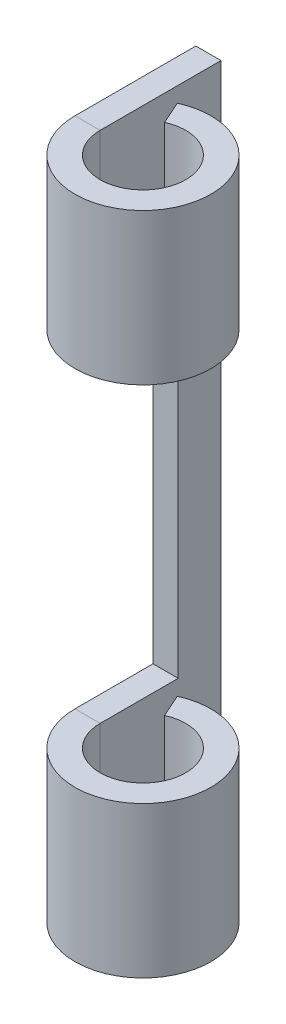
ISO-10303-21;
HEADER;
FILE_DESCRIPTION(('STEP AP214'),'2;1');
FILE_NAME('part.step','',(''),(''),'','','');
FILE_SCHEMA(('AUTOMOTIVE_DESIGN { 1 0 10303 214 1 1 1 1 }'));
ENDSEC;
DATA;
#1=APPLICATION_CONTEXT('core data for automotive mechanical design processes');
#2=APPLICATION_PROTOCOL_DEFINITION('international standard','automotive_design',2000,#1);
#3=PRODUCT_CONTEXT('',#1,'mechanical');
#4=PRODUCT('Part','Part','',(#3));
#5=PRODUCT_RELATED_PRODUCT_CATEGORY('part','',(#4));
#6=PRODUCT_DEFINITION_FORMATION('','',#4);
#7=PRODUCT_DEFINITION_CONTEXT('part definition',#1,'design');
#8=PRODUCT_DEFINITION('design','',#6,#7);
#9=PRODUCT_DEFINITION_SHAPE('','',#8);
#10=(LENGTH_UNIT() NAMED_UNIT(*) SI_UNIT(.MILLI.,.METRE.));
#11=(NAMED_UNIT(*) PLANE_ANGLE_UNIT() SI_UNIT($,.RADIAN.));
#12=(NAMED_UNIT(*) SI_UNIT($,.STERADIAN.) SOLID_ANGLE_UNIT());
#13=UNCERTAINTY_MEASURE_WITH_UNIT(LENGTH_MEASURE(1.E-05),#10,'distance_accuracy_value','');
#14=(GEOMETRIC_REPRESENTATION_CONTEXT(3) GLOBAL_UNCERTAINTY_ASSIGNED_CONTEXT((#13)) GLOBAL_UNIT_ASSIGNED_CONTEXT((#10,
#11,#12)) REPRESENTATION_CONTEXT('',''));
#15=CARTESIAN_POINT('',(0.,0.,0.));
#16=DIRECTION('',(0.,0.,1.));
#17=DIRECTION('',(1.,0.,0.));
#18=AXIS2_PLACEMENT_3D('',#15,#16,#17);
#19=CARTESIAN_POINT('',(-1.50000000000161,5.55111512312578E-13,11.2500000000008));
#20=DIRECTION('',(1.,0.,-2.12552198064484E-13));
#21=DIRECTION('',(2.12552198064484E-13,0.,1.));
#22=AXIS2_PLACEMENT_3D('',#19,#20,#21);
#23=PLANE('',#22);
#24=DIRECTION('',(0.,0.,-1.));
#25=VECTOR('',#24,1.);
#26=CARTESIAN_POINT('',(-1.50000000000383,-33.0000000000007,11.2500000000008));
#27=LINE('',#26,#25);
#28=CARTESIAN_POINT('',(-1.50000000000324,-33.0000000000007,5.25000000000105));
#29=VERTEX_POINT('',#28);
#30=CARTESIAN_POINT('',(-1.50000000000383,-33.0000000000006,17.2500000000015));
#31=VERTEX_POINT('',#30);
#32=EDGE_CURVE('E201',#29,#31,#27,.F.);
#33=ORIENTED_EDGE('',*,*,#32,.F.);
#34=DIRECTION('',(0.,1.,0.));
#35=VECTOR('',#34,1.);
#36=CARTESIAN_POINT('',(-1.50000000000206,3.33066907387547E-13,5.25000000000082));
#37=LINE('',#36,#35);
#38=CARTESIAN_POINT('',(-1.50000000000289,33.0000000000003,5.25000000000096));
#39=VERTEX_POINT('',#38);
#40=EDGE_CURVE('E204',#39,#29,#37,.F.);
#41=ORIENTED_EDGE('',*,*,#40,.F.);
#42=DIRECTION('',(0.,0.,-1.));
#43=VECTOR('',#42,1.);
#44=CARTESIAN_POINT('',(-1.50000000000206,33.,17.2523740439529));
#45=LINE('',#44,#43);
#46=CARTESIAN_POINT('',(-1.50000000000002,33.0000000000007,17.2500000000009));
#47=VERTEX_POINT('',#46);
#48=EDGE_CURVE('E207',#39,#47,#45,.F.);
#49=ORIENTED_EDGE('',*,*,#48,.T.);
#50=DIRECTION('',(0.,1.,0.));
#51=VECTOR('',#50,1.);
#52=CARTESIAN_POINT('',(-1.50000000000034,5.55111512312578E-13,17.250000000001));
#53=LINE('',#52,#51);
#54=CARTESIAN_POINT('',(-1.50000000000047,17.9999999999999,17.2500000000009));
#55=VERTEX_POINT('',#54);
#56=EDGE_CURVE('E210',#55,#47,#53,.T.);
#57=ORIENTED_EDGE('',*,*,#56,.F.);
#58=DIRECTION('',(0.,0.,-1.));
#59=VECTOR('',#58,1.);
#60=CARTESIAN_POINT('',(-1.50000000000139,17.9999999999999,20.6250000000014));
#61=LINE('',#60,#59);
#62=CARTESIAN_POINT('',(-1.50000000000039,17.9999999999999,9.50000000000092));
#63=VERTEX_POINT('',#62);
#64=EDGE_CURVE('E213',#63,#55,#61,.F.);
#65=ORIENTED_EDGE('',*,*,#64,.F.);
#66=DIRECTION('',(0.,1.,0.));
#67=VECTOR('',#66,1.);
#68=CARTESIAN_POINT('',(-1.50000000000139,5.55111512312578E-13,9.50000000000058));
#69=LINE('',#68,#67);
#70=CARTESIAN_POINT('',(-1.50000000000197,-18.0000000000002,9.50000000000092));
#71=VERTEX_POINT('',#70);
#72=EDGE_CURVE('E216',#63,#71,#69,.F.);
#73=ORIENTED_EDGE('',*,*,#72,.T.);
#74=DIRECTION('',(0.,0.,-1.));
#75=VECTOR('',#74,1.);
#76=CARTESIAN_POINT('',(-1.50000000000183,-18.0000000000002,13.3750000000007));
#77=LINE('',#76,#75);
#78=CARTESIAN_POINT('',(-1.50000000000208,-17.9999999999985,17.2500000000016));
#79=VERTEX_POINT('',#78);
#80=EDGE_CURVE('E218',#71,#79,#77,.F.);
#81=ORIENTED_EDGE('',*,*,#80,.T.);
#82=DIRECTION('',(0.,-1.,0.));
#83=VECTOR('',#82,1.);
#84=CARTESIAN_POINT('',(-1.50000000000381,-17.7000000000004,17.2500000000015));
#85=LINE('',#84,#83);
#86=EDGE_CURVE('E221',#31,#79,#85,.F.);
#87=ORIENTED_EDGE('',*,*,#86,.F.);
#88=EDGE_LOOP('',(#33,#41,#49,#57,#65,#73,#81,#87));
#89=FACE_BOUND('',#88,.T.);
#90=ADVANCED_FACE('F37',(#89),#23,.T.);
#91=CARTESIAN_POINT('',(132.664078649986,-33.0000000000065,11.2499999999722));
#92=DIRECTION('',(0.,-1.,0.));
#93=DIRECTION('',(1.,0.,0.));
#94=AXIS2_PLACEMENT_3D('',#91,#92,#93);
#95=PLANE('',#94);
#96=DIRECTION('',(2.12552198064484E-13,0.,1.));
#97=VECTOR('',#96,1.);
#98=CARTESIAN_POINT('',(-4.00000000000299,-33.0000000000007,11.250000000001));
#99=LINE('',#98,#97);
#100=CARTESIAN_POINT('',(-4.00000000000284,-33.0000000000006,5.25000000000158));
#101=VERTEX_POINT('',#100);
#102=CARTESIAN_POINT('',(-4.00000000000377,-33.0000000000003,17.250000000002));
#103=VERTEX_POINT('',#102);
#104=EDGE_CURVE('E52',#101,#103,#99,.T.);
#105=ORIENTED_EDGE('',*,*,#104,.F.);
#106=DIRECTION('',(-1.,0.,2.12552198064484E-13));
#107=VECTOR('',#106,1.);
#108=CARTESIAN_POINT('',(132.664078649986,-33.0000000000065,5.24999999997253));
#109=LINE('',#108,#107);
#110=EDGE_CURVE('E11',#29,#101,#109,.T.);
#111=ORIENTED_EDGE('',*,*,#110,.F.);
#112=ORIENTED_EDGE('',*,*,#32,.T.);
#113=DIRECTION('',(-1.,0.,2.12552198064484E-13));
#114=VECTOR('',#113,1.);
#115=CARTESIAN_POINT('',(132.664078649986,-33.0000000000064,17.2499999999729));
#116=LINE('',#115,#114);
#117=EDGE_CURVE('E224',#31,#103,#116,.T.);
#118=ORIENTED_EDGE('',*,*,#117,.T.);
#119=EDGE_LOOP('',(#105,#111,#112,#118));
#120=FACE_BOUND('',#119,.T.);
#121=ADVANCED_FACE('F39',(#120),#95,.T.);
#122=CARTESIAN_POINT('',(132.664078649988,-5.47606301121109E-12,5.24999999997231));
#123=DIRECTION('',(-2.12552198064484E-13,0.,-1.));
#124=DIRECTION('',(-1.,0.,2.12552198064484E-13));
#125=AXIS2_PLACEMENT_3D('',#122,#123,#124);
#126=PLANE('',#125);
#127=DIRECTION('',(0.,1.,0.));
#128=VECTOR('',#127,1.);
#129=CARTESIAN_POINT('',(-4.00000000000283,6.66133814775094E-13,5.25000000000123));
#130=LINE('',#129,#128);
#131=CARTESIAN_POINT('',(-4.00000000000014,33.0000000000004,5.25000000000149));
#132=VERTEX_POINT('',#131);
#133=EDGE_CURVE('E58',#132,#101,#130,.F.);
#134=ORIENTED_EDGE('',*,*,#133,.F.);
#135=DIRECTION('',(-1.,0.,2.12552198064484E-13));
#136=VECTOR('',#135,1.);
#137=CARTESIAN_POINT('',(132.664078649987,32.9999999999945,5.24999999997244));
#138=LINE('',#137,#136);
#139=EDGE_CURVE('E45',#39,#132,#138,.T.);
#140=ORIENTED_EDGE('',*,*,#139,.F.);
#141=ORIENTED_EDGE('',*,*,#40,.T.);
#142=ORIENTED_EDGE('',*,*,#110,.T.);
#143=EDGE_LOOP('',(#134,#140,#141,#142));
#144=FACE_BOUND('',#143,.T.);
#145=ADVANCED_FACE('F282',(#144),#126,.T.);
#146=CARTESIAN_POINT('',(132.664078649988,32.9999999999942,17.2523740439243));
#147=DIRECTION('',(0.,-1.,0.));
#148=DIRECTION('',(1.,0.,0.));
#149=AXIS2_PLACEMENT_3D('',#146,#147,#148);
#150=PLANE('',#149);
#151=ORIENTED_EDGE('',*,*,#139,.T.);
#152=DIRECTION('',(2.12552198064484E-13,0.,1.));
#153=VECTOR('',#152,1.);
#154=CARTESIAN_POINT('',(-4.00000000000013,33.0000000000005,11.250000000001));
#155=LINE('',#154,#153);
#156=CARTESIAN_POINT('',(-3.99999999999917,33.0000000000005,17.2500000000014));
#157=VERTEX_POINT('',#156);
#158=EDGE_CURVE('E196',#157,#132,#155,.F.);
#159=ORIENTED_EDGE('',*,*,#158,.F.);
#160=DIRECTION('',(-1.,0.,2.12552198064484E-13));
#161=VECTOR('',#160,1.);
#162=CARTESIAN_POINT('',(132.664078649989,32.9999999999946,17.2499999999723));
#163=LINE('',#162,#161);
#164=EDGE_CURVE('E236',#47,#157,#163,.T.);
#165=ORIENTED_EDGE('',*,*,#164,.F.);
#166=ORIENTED_EDGE('',*,*,#48,.F.);
#167=EDGE_LOOP('',(#151,#159,#165,#166));
#168=FACE_BOUND('',#167,.T.);
#169=ADVANCED_FACE('F241',(#168),#150,.F.);
#170=CARTESIAN_POINT('',(132.664078649988,17.9999999999941,20.6249999999729));
#171=DIRECTION('',(0.,-1.,0.));
#172=DIRECTION('',(1.,0.,0.));
#173=AXIS2_PLACEMENT_3D('',#170,#171,#172);
#174=PLANE('',#173);
#175=DIRECTION('',(2.12552198064484E-13,0.,1.));
#176=VECTOR('',#175,1.);
#177=CARTESIAN_POINT('',(-4.00000000000078,17.9999999999999,11.250000000001));
#178=LINE('',#177,#176);
#179=CARTESIAN_POINT('',(-4.00000000000192,18.,9.50000000000145));
#180=VERTEX_POINT('',#179);
#181=CARTESIAN_POINT('',(-4.00000000000042,18.,17.2500000000014));
#182=VERTEX_POINT('',#181);
#183=EDGE_CURVE('E190',#180,#182,#178,.T.);
#184=ORIENTED_EDGE('',*,*,#183,.F.);
#185=DIRECTION('',(-1.,0.,2.12552198064484E-13));
#186=VECTOR('',#185,1.);
#187=CARTESIAN_POINT('',(132.664078649989,17.9999999999941,9.4999999999724));
#188=LINE('',#187,#186);
#189=EDGE_CURVE('E230',#63,#180,#188,.T.);
#190=ORIENTED_EDGE('',*,*,#189,.F.);
#191=ORIENTED_EDGE('',*,*,#64,.T.);
#192=DIRECTION('',(-1.,0.,2.12552198064484E-13));
#193=VECTOR('',#192,1.);
#194=CARTESIAN_POINT('',(132.664078649989,17.9999999999941,17.2499999999723));
#195=LINE('',#194,#193);
#196=EDGE_CURVE('E233',#55,#182,#195,.T.);
#197=ORIENTED_EDGE('',*,*,#196,.T.);
#198=EDGE_LOOP('',(#184,#190,#191,#197));
#199=FACE_BOUND('',#198,.T.);
#200=ADVANCED_FACE('F251',(#199),#174,.T.);
#201=CARTESIAN_POINT('',(132.664078649988,-5.25401840628606E-12,9.49999999997206));
#202=DIRECTION('',(-2.12552198064484E-13,0.,-1.));
#203=DIRECTION('',(-1.,0.,2.12552198064484E-13));
#204=AXIS2_PLACEMENT_3D('',#201,#202,#203);
#205=PLANE('',#204);
#206=ORIENTED_EDGE('',*,*,#189,.T.);
#207=DIRECTION('',(0.,1.,0.));
#208=VECTOR('',#207,1.);
#209=CARTESIAN_POINT('',(-4.00000000000193,6.66133814775094E-13,9.50000000000109));
#210=LINE('',#209,#208);
#211=CARTESIAN_POINT('',(-4.00000000000189,-18.0000000000001,9.50000000000145));
#212=VERTEX_POINT('',#211);
#213=EDGE_CURVE('E187',#212,#180,#210,.T.);
#214=ORIENTED_EDGE('',*,*,#213,.F.);
#215=DIRECTION('',(-1.,0.,2.12552198064484E-13));
#216=VECTOR('',#215,1.);
#217=CARTESIAN_POINT('',(132.664078649988,-18.000000000006,9.49999999997241));
#218=LINE('',#217,#216);
#219=EDGE_CURVE('E227',#71,#212,#218,.T.);
#220=ORIENTED_EDGE('',*,*,#219,.F.);
#221=ORIENTED_EDGE('',*,*,#72,.F.);
#222=EDGE_LOOP('',(#206,#214,#220,#221));
#223=FACE_BOUND('',#222,.T.);
#224=ADVANCED_FACE('F286',(#223),#205,.F.);
#225=CARTESIAN_POINT('',(132.664078649988,-18.0000000000061,13.3749999999722));
#226=DIRECTION('',(0.,-1.,0.));
#227=DIRECTION('',(1.,0.,0.));
#228=AXIS2_PLACEMENT_3D('',#225,#226,#227);
#229=PLANE('',#228);
#230=ORIENTED_EDGE('',*,*,#219,.T.);
#231=DIRECTION('',(2.12552198064484E-13,0.,1.));
#232=VECTOR('',#231,1.);
#233=CARTESIAN_POINT('',(-4.00000000000234,-18.0000000000001,11.250000000001));
#234=LINE('',#233,#232);
#235=CARTESIAN_POINT('',(-4.00000000000097,-18.0000000000001,17.2500000000018));
#236=VERTEX_POINT('',#235);
#237=EDGE_CURVE('E184',#236,#212,#234,.F.);
#238=ORIENTED_EDGE('',*,*,#237,.F.);
#239=DIRECTION('',(-1.,0.,2.12552198064484E-13));
#240=VECTOR('',#239,1.);
#241=CARTESIAN_POINT('',(132.664078649988,-18.0000000000059,17.2499999999729));
#242=LINE('',#241,#240);
#243=EDGE_CURVE('E149',#79,#236,#242,.T.);
#244=ORIENTED_EDGE('',*,*,#243,.F.);
#245=ORIENTED_EDGE('',*,*,#80,.F.);
#246=EDGE_LOOP('',(#230,#238,#244,#245));
#247=FACE_BOUND('',#246,.T.);
#248=ADVANCED_FACE('F274',(#247),#229,.F.);
#249=CARTESIAN_POINT('',(-4.00000000000156,6.66133814775094E-13,11.250000000001));
#250=DIRECTION('',(1.,0.,-2.12552198064484E-13));
#251=DIRECTION('',(2.12552198064484E-13,0.,1.));
#252=AXIS2_PLACEMENT_3D('',#249,#250,#251);
#253=PLANE('',#252);
#254=DIRECTION('',(0.,1.,0.));
#255=VECTOR('',#254,1.);
#256=CARTESIAN_POINT('',(-4.00000000000028,6.66133814775094E-13,17.2500000000027));
#257=LINE('',#256,#255);
#258=EDGE_CURVE('E181',#103,#236,#257,.T.);
#259=ORIENTED_EDGE('',*,*,#258,.T.);
#260=ORIENTED_EDGE('',*,*,#237,.T.);
#261=ORIENTED_EDGE('',*,*,#213,.T.);
#262=ORIENTED_EDGE('',*,*,#183,.T.);
#263=DIRECTION('',(0.,1.,0.));
#264=VECTOR('',#263,1.);
#265=CARTESIAN_POINT('',(-4.00000000000028,6.66133814775094E-13,17.2500000000021));
#266=LINE('',#265,#264);
#267=EDGE_CURVE('E193',#182,#157,#266,.T.);
#268=ORIENTED_EDGE('',*,*,#267,.T.);
#269=ORIENTED_EDGE('',*,*,#158,.T.);
#270=ORIENTED_EDGE('',*,*,#133,.T.);
#271=ORIENTED_EDGE('',*,*,#104,.T.);
#272=EDGE_LOOP('',(#259,#260,#261,#262,#268,#269,#270,#271));
#273=FACE_BOUND('',#272,.T.);
#274=ADVANCED_FACE('F244',(#273),#253,.F.);
#275=CARTESIAN_POINT('',(0.712962962962864,25.5000000000004,12.683767405208));
#276=DIRECTION('',(-0.913246518958372,0.,0.407407407407397));
#277=DIRECTION('',(0.,1.,0.));
#278=AXIS2_PLACEMENT_3D('',#275,#276,#277);
#279=PLANE('',#278);
#280=DIRECTION('',(-0.407407407407392,0.,-0.913246518958374));
#281=VECTOR('',#280,1.);
#282=CARTESIAN_POINT('',(0.712962962962665,18.0000000000003,12.683767405208));
#283=LINE('',#282,#281);
#284=CARTESIAN_POINT('',(1.0185185185182,18.0000000000003,13.3687022944267));
#285=VERTEX_POINT('',#284);
#286=CARTESIAN_POINT('',(-2.55871712706579E-13,18.0000000000003,11.0855859970309));
#287=VERTEX_POINT('',#286);
#288=EDGE_CURVE('E179',#285,#287,#283,.T.);
#289=ORIENTED_EDGE('',*,*,#288,.F.);
#290=DIRECTION('',(0.,-1.,0.));
#291=VECTOR('',#290,1.);
#292=CARTESIAN_POINT('',(1.01851851852094,109.029773709158,13.3687022944271));
#293=LINE('',#292,#291);
#294=CARTESIAN_POINT('',(1.01851851851861,33.0000000000006,13.3687022944268));
#295=VERTEX_POINT('',#294);
#296=EDGE_CURVE('E173',#285,#295,#293,.F.);
#297=ORIENTED_EDGE('',*,*,#296,.T.);
#298=DIRECTION('',(-0.407407407407403,0.,-0.913246518958369));
#299=VECTOR('',#298,1.);
#300=CARTESIAN_POINT('',(0.712962962963062,33.0000000000006,12.6837674052081));
#301=LINE('',#300,#299);
#302=CARTESIAN_POINT('',(1.22731685925359E-13,33.0000000000006,11.0855859970309));
#303=VERTEX_POINT('',#302);
#304=EDGE_CURVE('E171',#295,#303,#301,.T.);
#305=ORIENTED_EDGE('',*,*,#304,.T.);
#306=DIRECTION('',(0.,-1.,0.));
#307=VECTOR('',#306,1.);
#308=CARTESIAN_POINT('',(2.46937886805298E-12,109.029773709158,11.0855859970312));
#309=LINE('',#308,#307);
#310=EDGE_CURVE('E164',#287,#303,#309,.F.);
#311=ORIENTED_EDGE('',*,*,#310,.F.);
#312=EDGE_LOOP('',(#289,#297,#305,#311));
#313=FACE_BOUND('',#312,.T.);
#314=ADVANCED_FACE('F266',(#313),#279,.T.);
#315=CARTESIAN_POINT('',(2.75000000000013,33.0000000000006,17.25));
#316=DIRECTION('',(0.,1.,0.));
#317=DIRECTION('',(-1.,0.,0.));
#318=AXIS2_PLACEMENT_3D('',#315,#316,#317);
#319=PLANE('',#318);
#320=ORIENTED_EDGE('',*,*,#304,.F.);
#321=CARTESIAN_POINT('',(2.75000000000013,33.0000000000005,17.25));
#322=DIRECTION('',(0.,-1.,0.));
#323=DIRECTION('',(1.,0.,0.));
#324=AXIS2_PLACEMENT_3D('',#321,#322,#323);
#325=CIRCLE('',#324,4.25000000000015);
#326=EDGE_CURVE('E161',#295,#47,#325,.T.);
#327=ORIENTED_EDGE('',*,*,#326,.T.);
#328=ORIENTED_EDGE('',*,*,#164,.T.);
#329=CARTESIAN_POINT('',(2.75000000000013,33.0000000000005,17.25));
#330=DIRECTION('',(0.,-1.,0.));
#331=DIRECTION('',(1.,0.,0.));
#332=AXIS2_PLACEMENT_3D('',#329,#330,#331);
#333=CIRCLE('',#332,6.7500000000001);
#334=EDGE_CURVE('E162',#303,#157,#333,.T.);
#335=ORIENTED_EDGE('',*,*,#334,.F.);
#336=EDGE_LOOP('',(#320,#327,#328,#335));
#337=FACE_BOUND('',#336,.T.);
#338=ADVANCED_FACE('F264',(#337),#319,.T.);
#339=CARTESIAN_POINT('',(2.74999999999968,17.9999999999998,17.25));
#340=DIRECTION('',(0.,-1.,0.));
#341=DIRECTION('',(1.,0.,0.));
#342=AXIS2_PLACEMENT_3D('',#339,#340,#341);
#343=PLANE('',#342);
#344=CARTESIAN_POINT('',(2.74999999999968,17.9999999999998,17.25));
#345=DIRECTION('',(0.,-1.,0.));
#346=DIRECTION('',(1.,0.,0.));
#347=AXIS2_PLACEMENT_3D('',#344,#345,#346);
#348=CIRCLE('',#347,4.25000000000015);
#349=EDGE_CURVE('E165',#55,#285,#348,.F.);
#350=ORIENTED_EDGE('',*,*,#349,.T.);
#351=ORIENTED_EDGE('',*,*,#288,.T.);
#352=CARTESIAN_POINT('',(2.74999999999968,17.9999999999998,17.25));
#353=DIRECTION('',(0.,-1.,0.));
#354=DIRECTION('',(1.,0.,0.));
#355=AXIS2_PLACEMENT_3D('',#352,#353,#354);
#356=CIRCLE('',#355,6.7500000000001);
#357=EDGE_CURVE('E168',#182,#287,#356,.F.);
#358=ORIENTED_EDGE('',*,*,#357,.F.);
#359=ORIENTED_EDGE('',*,*,#196,.F.);
#360=EDGE_LOOP('',(#350,#351,#358,#359));
#361=FACE_BOUND('',#360,.T.);
#362=ADVANCED_FACE('F255',(#361),#343,.T.);
#363=CARTESIAN_POINT('',(2.75000000000244,109.029773709158,17.2500000000003));
#364=DIRECTION('',(0.,-1.,0.));
#365=DIRECTION('',(1.,0.,0.));
#366=AXIS2_PLACEMENT_3D('',#363,#364,#365);
#367=CYLINDRICAL_SURFACE('',#366,6.7500000000001);
#368=ORIENTED_EDGE('',*,*,#267,.F.);
#369=ORIENTED_EDGE('',*,*,#357,.T.);
#370=ORIENTED_EDGE('',*,*,#310,.T.);
#371=ORIENTED_EDGE('',*,*,#334,.T.);
#372=EDGE_LOOP('',(#368,#369,#370,#371));
#373=FACE_BOUND('',#372,.T.);
#374=ADVANCED_FACE('F247',(#373),#367,.T.);
#375=CARTESIAN_POINT('',(2.75000000000244,109.029773709158,17.2500000000003));
#376=DIRECTION('',(0.,-1.,0.));
#377=DIRECTION('',(1.,0.,0.));
#378=AXIS2_PLACEMENT_3D('',#375,#376,#377);
#379=CYLINDRICAL_SURFACE('',#378,4.25000000000015);
#380=ORIENTED_EDGE('',*,*,#56,.T.);
#381=ORIENTED_EDGE('',*,*,#326,.F.);
#382=ORIENTED_EDGE('',*,*,#296,.F.);
#383=ORIENTED_EDGE('',*,*,#349,.F.);
#384=EDGE_LOOP('',(#380,#381,#382,#383));
#385=FACE_BOUND('',#384,.T.);
#386=ADVANCED_FACE('F259',(#385),#379,.F.);
#387=CARTESIAN_POINT('',(0.712962962962635,-25.4999999999989,12.6837674052079));
#388=DIRECTION('',(-0.913246518958593,0.,0.407407407406902));
#389=DIRECTION('',(0.,1.,0.));
#390=AXIS2_PLACEMENT_3D('',#387,#388,#389);
#391=PLANE('',#390);
#392=DIRECTION('',(-0.407407407406827,0.,-0.913246518958626));
#393=VECTOR('',#392,1.);
#394=CARTESIAN_POINT('',(0.712962962962136,-32.999999999999,12.6837674052073));
#395=LINE('',#394,#393);
#396=CARTESIAN_POINT('',(1.01851851851725,-32.9999999999991,13.3687022944263));
#397=VERTEX_POINT('',#396);
#398=CARTESIAN_POINT('',(2.03830008427275E-13,-32.9999999999989,11.0855859970297));
#399=VERTEX_POINT('',#398);
#400=EDGE_CURVE('E137',#397,#399,#395,.T.);
#401=ORIENTED_EDGE('',*,*,#400,.F.);
#402=DIRECTION('',(-1.16255384948375E-13,-1.,0.));
#403=VECTOR('',#402,1.);
#404=CARTESIAN_POINT('',(1.01851851852765,59.1785364610249,13.3687022944314));
#405=LINE('',#404,#403);
#406=CARTESIAN_POINT('',(1.01851851851836,-17.9999999999988,13.3687022944274));
#407=VERTEX_POINT('',#406);
#408=EDGE_CURVE('E133',#397,#407,#405,.F.);
#409=ORIENTED_EDGE('',*,*,#408,.T.);
#410=DIRECTION('',(-0.407407407406977,0.,-0.913246518958559));
#411=VECTOR('',#410,1.);
#412=CARTESIAN_POINT('',(0.712962962963133,-17.9999999999988,12.6837674052085));
#413=LINE('',#412,#411);
#414=CARTESIAN_POINT('',(9.40220123979429E-13,-17.9999999999986,11.085585997031));
#415=VERTEX_POINT('',#414);
#416=EDGE_CURVE('E128',#407,#415,#413,.T.);
#417=ORIENTED_EDGE('',*,*,#416,.T.);
#418=DIRECTION('',(-1.16255384948375E-13,-1.,0.));
#419=VECTOR('',#418,1.);
#420=CARTESIAN_POINT('',(1.04161471115027E-11,59.1785364610251,11.085585997035));
#421=LINE('',#420,#419);
#422=EDGE_CURVE('E131',#399,#415,#421,.F.);
#423=ORIENTED_EDGE('',*,*,#422,.F.);
#424=EDGE_LOOP('',(#401,#409,#417,#423));
#425=FACE_BOUND('',#424,.T.);
#426=ADVANCED_FACE('F130',(#425),#391,.T.);
#427=CARTESIAN_POINT('',(2.74999999999807,-17.999999999999,17.2500000000014));
#428=DIRECTION('',(1.16255384948361E-13,1.,0.));
#429=DIRECTION('',(-1.,1.16255384948361E-13,0.));
#430=AXIS2_PLACEMENT_3D('',#427,#428,#429);
#431=PLANE('',#430);
#432=ORIENTED_EDGE('',*,*,#416,.F.);
#433=CARTESIAN_POINT('',(2.74999999999807,-17.9999999999992,17.2500000000014));
#434=DIRECTION('',(-1.16255384948375E-13,-1.,0.));
#435=DIRECTION('',(1.,-1.16255384948375E-13,0.));
#436=AXIS2_PLACEMENT_3D('',#433,#434,#435);
#437=CIRCLE('',#436,4.25000000000015);
#438=EDGE_CURVE('E157',#407,#79,#437,.T.);
#439=ORIENTED_EDGE('',*,*,#438,.T.);
#440=ORIENTED_EDGE('',*,*,#243,.T.);
#441=CARTESIAN_POINT('',(2.74999999999807,-17.9999999999992,17.2500000000014));
#442=DIRECTION('',(-1.16255384948375E-13,-1.,0.));
#443=DIRECTION('',(1.,-1.16255384948375E-13,0.));
#444=AXIS2_PLACEMENT_3D('',#441,#442,#443);
#445=CIRCLE('',#444,6.7500000000001);
#446=EDGE_CURVE('E144',#415,#236,#445,.T.);
#447=ORIENTED_EDGE('',*,*,#446,.F.);
#448=EDGE_LOOP('',(#432,#439,#440,#447));
#449=FACE_BOUND('',#448,.T.);
#450=ADVANCED_FACE('F147',(#449),#431,.T.);
#451=CARTESIAN_POINT('',(2.74999999999633,-33.0000000000011,17.2500000000006));
#452=DIRECTION('',(-1.16255384948362E-13,-1.,0.));
#453=DIRECTION('',(1.,-1.16255384948362E-13,0.));
#454=AXIS2_PLACEMENT_3D('',#451,#452,#453);
#455=PLANE('',#454);
#456=CARTESIAN_POINT('',(2.74999999999633,-33.0000000000011,17.2500000000006));
#457=DIRECTION('',(-1.16255384948375E-13,-1.,0.));
#458=DIRECTION('',(1.,-1.16255384948375E-13,0.));
#459=AXIS2_PLACEMENT_3D('',#456,#457,#458);
#460=CIRCLE('',#459,4.25000000000015);
#461=EDGE_CURVE('E151',#31,#397,#460,.F.);
#462=ORIENTED_EDGE('',*,*,#461,.T.);
#463=ORIENTED_EDGE('',*,*,#400,.T.);
#464=CARTESIAN_POINT('',(2.74999999999633,-33.0000000000011,17.2500000000006));
#465=DIRECTION('',(-1.16255384948375E-13,-1.,0.));
#466=DIRECTION('',(1.,-1.16255384948375E-13,0.));
#467=AXIS2_PLACEMENT_3D('',#464,#465,#466);
#468=CIRCLE('',#467,6.7500000000001);
#469=EDGE_CURVE('E138',#103,#399,#468,.F.);
#470=ORIENTED_EDGE('',*,*,#469,.F.);
#471=ORIENTED_EDGE('',*,*,#117,.F.);
#472=EDGE_LOOP('',(#462,#463,#470,#471));
#473=FACE_BOUND('',#472,.T.);
#474=ADVANCED_FACE('F374',(#473),#455,.T.);
#475=CARTESIAN_POINT('',(2.75000000000704,59.1785364610245,17.2500000000056));
#476=DIRECTION('',(-1.16255384948375E-13,-1.,0.));
#477=DIRECTION('',(1.,-1.16255384948375E-13,0.));
#478=AXIS2_PLACEMENT_3D('',#475,#476,#477);
#479=CYLINDRICAL_SURFACE('',#478,6.7500000000001);
#480=ORIENTED_EDGE('',*,*,#258,.F.);
#481=ORIENTED_EDGE('',*,*,#469,.T.);
#482=ORIENTED_EDGE('',*,*,#422,.T.);
#483=ORIENTED_EDGE('',*,*,#446,.T.);
#484=EDGE_LOOP('',(#480,#481,#482,#483));
#485=FACE_BOUND('',#484,.T.);
#486=ADVANCED_FACE('F143',(#485),#479,.T.);
#487=CARTESIAN_POINT('',(2.75000000000704,59.1785364610245,17.2500000000056));
#488=DIRECTION('',(-1.16255384948375E-13,-1.,0.));
#489=DIRECTION('',(1.,-1.16255384948375E-13,0.));
#490=AXIS2_PLACEMENT_3D('',#487,#488,#489);
#491=CYLINDRICAL_SURFACE('',#490,4.25000000000015);
#492=ORIENTED_EDGE('',*,*,#86,.T.);
#493=ORIENTED_EDGE('',*,*,#438,.F.);
#494=ORIENTED_EDGE('',*,*,#408,.F.);
#495=ORIENTED_EDGE('',*,*,#461,.F.);
#496=EDGE_LOOP('',(#492,#493,#494,#495));
#497=FACE_BOUND('',#496,.T.);
#498=ADVANCED_FACE('F390',(#497),#491,.F.);
#499=CLOSED_SHELL('',(#90,#121,#145,#169,#200,#224,#248,#274,#314,#338,#362,#374,#386,#426,#450,
#474,#486,#498));
#500=MANIFOLD_SOLID_BREP('B2',#499);
#501=ADVANCED_BREP_SHAPE_REPRESENTATION('',(#18,#500),#14);
#502=SHAPE_DEFINITION_REPRESENTATION(#9,#501);
ENDSEC;
END-ISO-10303-21;
